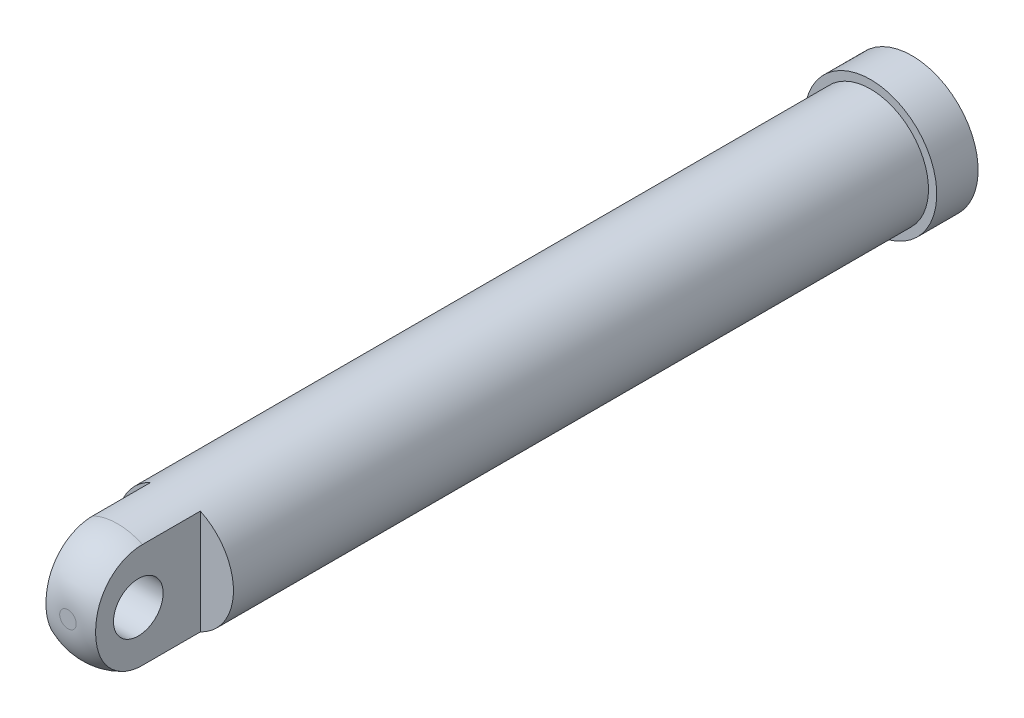
ISO-10303-21;
HEADER;
FILE_DESCRIPTION(('STEP AP214'),'2;1');
FILE_NAME('part.step','',(''),(''),'','','');
FILE_SCHEMA(('AUTOMOTIVE_DESIGN { 1 0 10303 214 1 1 1 1 }'));
ENDSEC;
DATA;
#1=APPLICATION_CONTEXT('core data for automotive mechanical design processes');
#2=APPLICATION_PROTOCOL_DEFINITION('international standard','automotive_design',2000,#1);
#3=PRODUCT_CONTEXT('',#1,'mechanical');
#4=PRODUCT('Part','Part','',(#3));
#5=PRODUCT_RELATED_PRODUCT_CATEGORY('part','',(#4));
#6=PRODUCT_DEFINITION_FORMATION('','',#4);
#7=PRODUCT_DEFINITION_CONTEXT('part definition',#1,'design');
#8=PRODUCT_DEFINITION('design','',#6,#7);
#9=PRODUCT_DEFINITION_SHAPE('','',#8);
#10=(LENGTH_UNIT() NAMED_UNIT(*) SI_UNIT(.MILLI.,.METRE.));
#11=(NAMED_UNIT(*) PLANE_ANGLE_UNIT() SI_UNIT($,.RADIAN.));
#12=(NAMED_UNIT(*) SI_UNIT($,.STERADIAN.) SOLID_ANGLE_UNIT());
#13=UNCERTAINTY_MEASURE_WITH_UNIT(LENGTH_MEASURE(1.E-05),#10,'distance_accuracy_value','');
#14=(GEOMETRIC_REPRESENTATION_CONTEXT(3) GLOBAL_UNCERTAINTY_ASSIGNED_CONTEXT((#13)) GLOBAL_UNIT_ASSIGNED_CONTEXT((#10,
#11,#12)) REPRESENTATION_CONTEXT('',''));
#15=CARTESIAN_POINT('',(0.,0.,0.));
#16=DIRECTION('',(0.,0.,1.));
#17=DIRECTION('',(1.,0.,0.));
#18=AXIS2_PLACEMENT_3D('',#15,#16,#17);
#19=CARTESIAN_POINT('',(0.,0.,396.75));
#20=DIRECTION('',(0.,0.,-1.));
#21=DIRECTION('',(-1.,0.,0.));
#22=AXIS2_PLACEMENT_3D('',#19,#20,#21);
#23=CYLINDRICAL_SURFACE('',#22,24.15);
#24=DIRECTION('',(0.,0.,1.));
#25=VECTOR('',#24,1.);
#26=CARTESIAN_POINT('',(10.35,-21.8197158551618,351.9));
#27=LINE('',#26,#25);
#28=CARTESIAN_POINT('',(10.35,-21.8197158551618,351.9));
#29=VERTEX_POINT('',#28);
#30=CARTESIAN_POINT('',(10.35,-21.8197158551618,376.05));
#31=VERTEX_POINT('',#30);
#32=EDGE_CURVE('E107',#29,#31,#27,.T.);
#33=ORIENTED_EDGE('',*,*,#32,.T.);
#34=CARTESIAN_POINT('',(0.,0.,376.05));
#35=DIRECTION('',(0.,0.,1.));
#36=DIRECTION('',(1.,0.,0.));
#37=AXIS2_PLACEMENT_3D('',#34,#35,#36);
#38=CIRCLE('',#37,24.15);
#39=CARTESIAN_POINT('',(-10.35,-21.8197158551618,376.05));
#40=VERTEX_POINT('',#39);
#41=EDGE_CURVE('E117',#31,#40,#38,.F.);
#42=ORIENTED_EDGE('',*,*,#41,.T.);
#43=DIRECTION('',(0.,0.,1.));
#44=VECTOR('',#43,1.);
#45=CARTESIAN_POINT('',(-10.35,-21.8197158551618,351.9));
#46=LINE('',#45,#44);
#47=CARTESIAN_POINT('',(-10.35,-21.8197158551618,351.9));
#48=VERTEX_POINT('',#47);
#49=EDGE_CURVE('E87',#48,#40,#46,.T.);
#50=ORIENTED_EDGE('',*,*,#49,.F.);
#51=CARTESIAN_POINT('',(0.,0.,351.9));
#52=DIRECTION('',(0.,0.,1.));
#53=DIRECTION('',(1.,0.,0.));
#54=AXIS2_PLACEMENT_3D('',#51,#52,#53);
#55=CIRCLE('',#54,24.15);
#56=CARTESIAN_POINT('',(-10.35,21.8197158551618,351.9));
#57=VERTEX_POINT('',#56);
#58=EDGE_CURVE('E88',#57,#48,#55,.T.);
#59=ORIENTED_EDGE('',*,*,#58,.F.);
#60=DIRECTION('',(0.,0.,1.));
#61=VECTOR('',#60,1.);
#62=CARTESIAN_POINT('',(-10.35,21.8197158551618,351.9));
#63=LINE('',#62,#61);
#64=CARTESIAN_POINT('',(-10.35,21.8197158551618,376.05));
#65=VERTEX_POINT('',#64);
#66=EDGE_CURVE('E79',#57,#65,#63,.T.);
#67=ORIENTED_EDGE('',*,*,#66,.T.);
#68=CARTESIAN_POINT('',(0.,0.,376.05));
#69=DIRECTION('',(0.,0.,1.));
#70=DIRECTION('',(1.,0.,0.));
#71=AXIS2_PLACEMENT_3D('',#68,#69,#70);
#72=CIRCLE('',#71,24.15);
#73=CARTESIAN_POINT('',(10.35,21.8197158551618,376.05));
#74=VERTEX_POINT('',#73);
#75=EDGE_CURVE('E115',#65,#74,#72,.F.);
#76=ORIENTED_EDGE('',*,*,#75,.T.);
#77=DIRECTION('',(0.,0.,1.));
#78=VECTOR('',#77,1.);
#79=CARTESIAN_POINT('',(10.35,21.8197158551618,351.9));
#80=LINE('',#79,#78);
#81=CARTESIAN_POINT('',(10.35,21.8197158551618,351.9));
#82=VERTEX_POINT('',#81);
#83=EDGE_CURVE('E106',#82,#74,#80,.T.);
#84=ORIENTED_EDGE('',*,*,#83,.F.);
#85=CARTESIAN_POINT('',(0.,0.,351.9));
#86=DIRECTION('',(0.,0.,1.));
#87=DIRECTION('',(1.,0.,0.));
#88=AXIS2_PLACEMENT_3D('',#85,#86,#87);
#89=CIRCLE('',#88,24.15);
#90=EDGE_CURVE('E100',#29,#82,#89,.T.);
#91=ORIENTED_EDGE('',*,*,#90,.F.);
#92=EDGE_LOOP('',(#33,#42,#50,#59,#67,#76,#84,#91));
#93=FACE_BOUND('',#92,.T.);
#94=CARTESIAN_POINT('',(0.,0.,62.1));
#95=DIRECTION('',(0.,0.,-1.));
#96=DIRECTION('',(-1.,0.,0.));
#97=AXIS2_PLACEMENT_3D('',#94,#95,#96);
#98=CIRCLE('',#97,24.15);
#99=CARTESIAN_POINT('',(-24.15,0.,62.1));
#100=VERTEX_POINT('',#99);
#101=EDGE_CURVE('E11',#100,#100,#98,.T.);
#102=ORIENTED_EDGE('',*,*,#101,.F.);
#103=EDGE_LOOP('',(#102));
#104=FACE_BOUND('',#103,.T.);
#105=ADVANCED_FACE('F35',(#93,#104),#23,.T.);
#106=CARTESIAN_POINT('',(0.,0.,396.75));
#107=DIRECTION('',(0.,0.,1.));
#108=DIRECTION('',(1.,0.,0.));
#109=AXIS2_PLACEMENT_3D('',#106,#107,#108);
#110=PLANE('',#109);
#111=CARTESIAN_POINT('',(0.,0.,396.75));
#112=DIRECTION('',(0.,0.,1.));
#113=DIRECTION('',(1.,0.,0.));
#114=AXIS2_PLACEMENT_3D('',#111,#112,#113);
#115=CIRCLE('',#114,3.45000000000001);
#116=CARTESIAN_POINT('',(1.47857142857143,3.11710226502312,396.75));
#117=VERTEX_POINT('',#116);
#118=EDGE_CURVE('E49',#117,#117,#115,.T.);
#119=ORIENTED_EDGE('',*,*,#118,.T.);
#120=EDGE_LOOP('',(#119));
#121=FACE_BOUND('',#120,.T.);
#122=ADVANCED_FACE('F141',(#121),#110,.T.);
#123=CARTESIAN_POINT('',(10.35,0.,351.9));
#124=DIRECTION('',(-1.,0.,0.));
#125=DIRECTION('',(0.,-1.,0.));
#126=AXIS2_PLACEMENT_3D('',#123,#124,#125);
#127=PLANE('',#126);
#128=CARTESIAN_POINT('',(10.35,0.,377.775));
#129=DIRECTION('',(1.,0.,0.));
#130=DIRECTION('',(0.,0.,-1.));
#131=AXIS2_PLACEMENT_3D('',#128,#129,#130);
#132=CIRCLE('',#131,10.35);
#133=CARTESIAN_POINT('',(10.35,0.,367.425));
#134=VERTEX_POINT('',#133);
#135=EDGE_CURVE('E113',#134,#134,#132,.T.);
#136=ORIENTED_EDGE('',*,*,#135,.F.);
#137=EDGE_LOOP('',(#136));
#138=FACE_BOUND('',#137,.T.);
#139=ORIENTED_EDGE('',*,*,#83,.T.);
#140=CARTESIAN_POINT('',(10.35,21.8197158551618,376.05));
#141=CARTESIAN_POINT('',(10.35,21.8197163898058,376.314426720202));
#142=CARTESIAN_POINT('',(10.35,21.8141072582747,376.578823668274));
#143=CARTESIAN_POINT('',(10.35,21.7916878615412,377.107135632862));
#144=CARTESIAN_POINT('',(10.35,21.774877875815,377.371050661237));
#145=CARTESIAN_POINT('',(10.35,21.7076864753367,378.161306675301));
#146=CARTESIAN_POINT('',(10.35,21.6405435948251,378.686312068646));
#147=CARTESIAN_POINT('',(10.35,21.4621792681263,379.728037604999));
#148=CARTESIAN_POINT('',(10.35,21.3510183465244,380.244768115108));
#149=CARTESIAN_POINT('',(10.35,21.1519259295457,381.011301720175));
#150=CARTESIAN_POINT('',(10.35,21.0801660283793,381.265397039785));
#151=CARTESIAN_POINT('',(10.35,20.9259768285565,381.770399541436));
#152=CARTESIAN_POINT('',(10.35,20.8435448493958,382.02130590506));
#153=CARTESIAN_POINT('',(10.35,20.5804626083983,382.768553413826));
#154=CARTESIAN_POINT('',(10.35,20.3840245027687,383.259428902161));
#155=CARTESIAN_POINT('',(10.35,19.9506061989533,384.2229421687));
#156=CARTESIAN_POINT('',(10.35,19.7136255813996,384.695579758191));
#157=CARTESIAN_POINT('',(10.35,19.3291767374711,385.388363382799));
#158=CARTESIAN_POINT('',(10.35,19.1961707452856,385.616635689311));
#159=CARTESIAN_POINT('',(10.35,18.9207804004236,386.067369224545));
#160=CARTESIAN_POINT('',(10.35,18.7783984674602,386.289831932052));
#161=CARTESIAN_POINT('',(10.35,18.3375069899879,386.948067682192));
#162=CARTESIAN_POINT('',(10.35,18.0252289538684,387.374729429344));
#163=CARTESIAN_POINT('',(10.35,17.3642140739705,388.203578811306));
#164=CARTESIAN_POINT('',(10.35,17.0152389596325,388.605575774716));
#165=CARTESIAN_POINT('',(10.35,16.2852865760025,389.379388931453));
#166=CARTESIAN_POINT('',(10.35,15.9043092989692,389.75120511748));
#167=CARTESIAN_POINT('',(10.35,15.1133586004994,390.462385540926));
#168=CARTESIAN_POINT('',(10.35,14.7033916202454,390.80175694804));
#169=CARTESIAN_POINT('',(10.35,13.8574706400294,391.446378775191));
#170=CARTESIAN_POINT('',(10.35,13.4215161745234,391.751628583688));
#171=CARTESIAN_POINT('',(10.35,12.5130737905583,392.335538227294));
#172=CARTESIAN_POINT('',(10.35,12.0398744696788,392.613090755877));
#173=CARTESIAN_POINT('',(10.35,11.0729317660166,393.129658640617));
#174=CARTESIAN_POINT('',(10.35,10.579188378746,393.368673988355));
#175=CARTESIAN_POINT('',(10.35,9.57457122598523,393.808036218003));
#176=CARTESIAN_POINT('',(10.35,9.06369028877769,394.008366668025));
#177=CARTESIAN_POINT('',(10.35,8.02854510435635,394.370710959167));
#178=CARTESIAN_POINT('',(10.35,7.5042797300904,394.532721561651));
#179=CARTESIAN_POINT('',(10.35,6.25217150693814,394.871976583993));
#180=CARTESIAN_POINT('',(10.35,5.51995283923633,395.033148795995));
#181=CARTESIAN_POINT('',(10.35,4.04404700894939,395.290747522017));
#182=CARTESIAN_POINT('',(10.35,3.30035479995983,395.38714466455));
#183=CARTESIAN_POINT('',(10.35,2.17987579464592,395.486895250026));
#184=CARTESIAN_POINT('',(10.35,1.80492570641525,395.512676640977));
#185=CARTESIAN_POINT('',(10.35,1.05431576471458,395.549573677225));
#186=CARTESIAN_POINT('',(10.35,0.678655976563356,395.560690612073));
#187=CARTESIAN_POINT('',(10.35,-0.0727343236145097,395.568467886445));
#188=CARTESIAN_POINT('',(10.35,-0.44846480847418,395.565130983685));
#189=CARTESIAN_POINT('',(10.35,-1.199652059975,395.543941168084));
#190=CARTESIAN_POINT('',(10.35,-1.57510867991491,395.526083044107));
#191=CARTESIAN_POINT('',(10.35,-2.33227028224054,395.475036270462));
#192=CARTESIAN_POINT('',(10.35,-2.71395617934209,395.441558704995));
#193=CARTESIAN_POINT('',(10.35,-3.47557954987655,395.358653398626));
#194=CARTESIAN_POINT('',(10.35,-3.85551689464285,395.3092245024));
#195=CARTESIAN_POINT('',(10.35,-4.99158961351029,395.135970377301));
#196=CARTESIAN_POINT('',(10.35,-5.74421309374333,394.987163221526));
#197=CARTESIAN_POINT('',(10.35,-6.85802359841206,394.710674257788));
#198=CARTESIAN_POINT('',(10.35,-7.22608244839668,394.609875247041));
#199=CARTESIAN_POINT('',(10.35,-7.95670956229317,394.390050092547));
#200=CARTESIAN_POINT('',(10.35,-8.31927859494068,394.271026527202));
#201=CARTESIAN_POINT('',(10.35,-9.03770420857311,394.014440235444));
#202=CARTESIAN_POINT('',(10.35,-9.3935623976585,393.876882016479));
#203=CARTESIAN_POINT('',(10.35,-10.0974416866775,393.583052035536));
#204=CARTESIAN_POINT('',(10.35,-10.44546307163,393.426780955442));
#205=CARTESIAN_POINT('',(10.35,-11.2923077628391,393.018415829256));
#206=CARTESIAN_POINT('',(10.35,-11.7859964327409,392.755555710352));
#207=CARTESIAN_POINT('',(10.35,-12.7500207429692,392.190213058397));
#208=CARTESIAN_POINT('',(10.35,-13.2203601904227,391.88773701424));
#209=CARTESIAN_POINT('',(10.35,-14.1343904267923,391.244092146487));
#210=CARTESIAN_POINT('',(10.35,-14.5780593056893,390.902892157872));
#211=CARTESIAN_POINT('',(10.35,-15.434665448902,390.183822042701));
#212=CARTESIAN_POINT('',(10.35,-15.8476014732961,389.805950438039));
#213=CARTESIAN_POINT('',(10.35,-16.6400535502352,389.015102354244));
#214=CARTESIAN_POINT('',(10.35,-17.0195007171076,388.602056799569));
#215=CARTESIAN_POINT('',(10.35,-17.7408061982901,387.744338357899));
#216=CARTESIAN_POINT('',(10.35,-18.0826643814009,387.299665360522));
#217=CARTESIAN_POINT('',(10.35,-18.7257344997865,386.382080182752));
#218=CARTESIAN_POINT('',(10.35,-19.0269619751321,385.909178899262));
#219=CARTESIAN_POINT('',(10.35,-19.5863140684447,384.938566373604));
#220=CARTESIAN_POINT('',(10.35,-19.8444402256896,384.440856018266));
#221=CARTESIAN_POINT('',(10.35,-20.3054718261749,383.445786718284));
#222=CARTESIAN_POINT('',(10.35,-20.5102449247515,382.949295583655));
#223=CARTESIAN_POINT('',(10.35,-20.7849492492941,382.192957673066));
#224=CARTESIAN_POINT('',(10.35,-20.8711106058127,381.938902327321));
#225=CARTESIAN_POINT('',(10.35,-21.0324955751728,381.427264504519));
#226=CARTESIAN_POINT('',(10.35,-21.1077162244807,381.169681092402));
#227=CARTESIAN_POINT('',(10.35,-21.3166784189799,380.392479258435));
#228=CARTESIAN_POINT('',(10.35,-21.4337647910346,379.868286484958));
#229=CARTESIAN_POINT('',(10.35,-21.6224809524453,378.811783706652));
#230=CARTESIAN_POINT('',(10.35,-21.6941112596733,378.279473794371));
#231=CARTESIAN_POINT('',(10.35,-21.7666415632442,377.482522401876));
#232=CARTESIAN_POINT('',(10.35,-21.7849866209967,377.219372099423));
#233=CARTESIAN_POINT('',(10.35,-21.8105324974311,376.692600108099));
#234=CARTESIAN_POINT('',(10.35,-21.8177362539687,376.428978561855));
#235=CARTESIAN_POINT('',(10.35,-21.8226086488527,375.637971682625));
#236=CARTESIAN_POINT('',(10.35,-21.8035428946739,375.110394790701));
#237=CARTESIAN_POINT('',(10.35,-21.72086029895,374.058316730138));
#238=CARTESIAN_POINT('',(10.35,-21.6572076176794,373.533818378323));
#239=CARTESIAN_POINT('',(10.35,-21.5286995538489,372.752613373251));
#240=CARTESIAN_POINT('',(10.35,-21.4803500285391,372.493101171352));
#241=CARTESIAN_POINT('',(10.35,-21.3727308226419,371.976342867929));
#242=CARTESIAN_POINT('',(10.35,-21.3134608161966,371.719096834266));
#243=CARTESIAN_POINT('',(10.35,-21.2487778126976,371.463188848341));
#244=B_SPLINE_CURVE_WITH_KNOTS('',3,(#140,#141,#142,#143,#144,#145,#146,#147,#148,#149,#150,
#151,#152,#153,#154,#155,#156,#157,#158,#159,#160,#161,#162,#163,#164,#165,#166,#167,#168,#169,
#170,#171,#172,#173,#174,#175,#176,#177,#178,#179,#180,#181,#182,#183,#184,#185,#186,#187,#188,
#189,#190,#191,#192,#193,#194,#195,#196,#197,#198,#199,#200,#201,#202,#203,#204,#205,#206,#207,
#208,#209,#210,#211,#212,#213,#214,#215,#216,#217,#218,#219,#220,#221,#222,#223,#224,#225,#226,
#227,#228,#229,#230,#231,#232,#233,#234,#235,#236,#237,#238,#239,#240,#241,#242,#243),
.UNSPECIFIED.,.F.,.F.,(4,2,2,2,2,2,2,2,2,2,2,2,2,2,2,2,2,2,2,2,2,2,2,2,2,2,2,2,2,2,2,2,2,2,2,2,
2,2,2,2,2,2,2,2,2,2,2,2,2,2,2,4),(0.,0.793161277684144,1.58630276567981,3.17212681726539,
4.75577789831348,5.54767409766578,6.33976958476033,7.92394225195834,9.5081313066826,
10.3005130089286,11.0926910112352,12.6769064992564,14.2721305909451,15.8673550685231,
17.4622262123594,19.0571259355623,20.7011051060827,22.345084635741,23.9897609373033,
25.6345761905466,27.8805256920781,30.1274929068285,31.2547678384195,32.3819436340067,
33.5089043797467,34.6362697290339,35.7853692544243,36.9345520256002,39.2322359978884,
40.3767025387888,41.5210073103958,42.6650342988446,43.8090196124376,45.4850018111027,
47.1607098346205,48.8377761607517,50.5149101117427,52.1954171685542,53.8759300907694,
55.5557984317214,57.2356067666773,58.8446766758452,59.6492684438145,60.4540777490612,
62.0633058817002,63.6725156803934,64.4636775278628,65.2546307178446,66.8363890182999,
68.4194202240135,69.2111473239715,70.0028980522257),.UNSPECIFIED.);
#245=EDGE_CURVE('E44',#74,#31,#244,.T.);
#246=ORIENTED_EDGE('',*,*,#245,.T.);
#247=ORIENTED_EDGE('',*,*,#32,.F.);
#248=DIRECTION('',(0.,-1.,0.));
#249=VECTOR('',#248,1.);
#250=CARTESIAN_POINT('',(10.35,0.,351.9));
#251=LINE('',#250,#249);
#252=EDGE_CURVE('E103',#82,#29,#251,.T.);
#253=ORIENTED_EDGE('',*,*,#252,.F.);
#254=EDGE_LOOP('',(#139,#246,#247,#253));
#255=FACE_BOUND('',#254,.T.);
#256=ADVANCED_FACE('F136',(#138,#255),#127,.F.);
#257=CARTESIAN_POINT('',(0.,0.,351.9));
#258=DIRECTION('',(0.,0.,1.));
#259=DIRECTION('',(1.,0.,0.));
#260=AXIS2_PLACEMENT_3D('',#257,#258,#259);
#261=PLANE('',#260);
#262=ORIENTED_EDGE('',*,*,#90,.T.);
#263=ORIENTED_EDGE('',*,*,#252,.T.);
#264=EDGE_LOOP('',(#262,#263));
#265=FACE_BOUND('',#264,.T.);
#266=ADVANCED_FACE('F132',(#265),#261,.T.);
#267=CARTESIAN_POINT('',(-10.35,0.,351.9));
#268=DIRECTION('',(-1.,0.,0.));
#269=DIRECTION('',(0.,-1.,0.));
#270=AXIS2_PLACEMENT_3D('',#267,#268,#269);
#271=PLANE('',#270);
#272=CARTESIAN_POINT('',(-10.35,0.,377.775));
#273=DIRECTION('',(-1.,0.,0.));
#274=DIRECTION('',(0.,-1.,0.));
#275=AXIS2_PLACEMENT_3D('',#272,#273,#274);
#276=CIRCLE('',#275,10.35);
#277=CARTESIAN_POINT('',(-10.35,-10.35,377.775));
#278=VERTEX_POINT('',#277);
#279=EDGE_CURVE('E93',#278,#278,#276,.T.);
#280=ORIENTED_EDGE('',*,*,#279,.F.);
#281=EDGE_LOOP('',(#280));
#282=FACE_BOUND('',#281,.T.);
#283=ORIENTED_EDGE('',*,*,#49,.T.);
#284=CARTESIAN_POINT('',(-10.35,-21.8197158551618,376.05));
#285=CARTESIAN_POINT('',(-10.35,-21.8197163898058,376.314426720202));
#286=CARTESIAN_POINT('',(-10.35,-21.8141072582747,376.578823668274));
#287=CARTESIAN_POINT('',(-10.35,-21.7916878615412,377.107135632862));
#288=CARTESIAN_POINT('',(-10.35,-21.774877875815,377.371050661237));
#289=CARTESIAN_POINT('',(-10.35,-21.7076864753367,378.161306675301));
#290=CARTESIAN_POINT('',(-10.35,-21.6405435948251,378.686312068646));
#291=CARTESIAN_POINT('',(-10.35,-21.4621792681264,379.728037604999));
#292=CARTESIAN_POINT('',(-10.35,-21.3510183465244,380.244768115108));
#293=CARTESIAN_POINT('',(-10.35,-21.1519259295458,381.011301720175));
#294=CARTESIAN_POINT('',(-10.35,-21.0801660283794,381.265397039785));
#295=CARTESIAN_POINT('',(-10.35,-20.9259768285566,381.770399541436));
#296=CARTESIAN_POINT('',(-10.35,-20.8435448493958,382.02130590506));
#297=CARTESIAN_POINT('',(-10.35,-20.5804626083983,382.768553413826));
#298=CARTESIAN_POINT('',(-10.35,-20.3840245027687,383.259428902161));
#299=CARTESIAN_POINT('',(-10.35,-19.9506061989533,384.2229421687));
#300=CARTESIAN_POINT('',(-10.35,-19.7136255813995,384.695579758191));
#301=CARTESIAN_POINT('',(-10.35,-19.329176737471,385.388363382799));
#302=CARTESIAN_POINT('',(-10.35,-19.1961707452856,385.616635689311));
#303=CARTESIAN_POINT('',(-10.35,-18.9207804004236,386.067369224545));
#304=CARTESIAN_POINT('',(-10.35,-18.7783984674602,386.289831932052));
#305=CARTESIAN_POINT('',(-10.35,-18.3375069899879,386.948067682192));
#306=CARTESIAN_POINT('',(-10.35,-18.0252289538684,387.374729429344));
#307=CARTESIAN_POINT('',(-10.35,-17.3642140739705,388.203578811306));
#308=CARTESIAN_POINT('',(-10.35,-17.0152389596325,388.605575774716));
#309=CARTESIAN_POINT('',(-10.35,-16.2852865760025,389.379388931453));
#310=CARTESIAN_POINT('',(-10.35,-15.9043092989692,389.75120511748));
#311=CARTESIAN_POINT('',(-10.35,-15.1133586004994,390.462385540926));
#312=CARTESIAN_POINT('',(-10.35,-14.7033916202455,390.80175694804));
#313=CARTESIAN_POINT('',(-10.35,-13.8574706400294,391.446378775191));
#314=CARTESIAN_POINT('',(-10.35,-13.4215161745234,391.751628583688));
#315=CARTESIAN_POINT('',(-10.35,-12.5130737905583,392.335538227294));
#316=CARTESIAN_POINT('',(-10.35,-12.0398744696788,392.613090755877));
#317=CARTESIAN_POINT('',(-10.35,-11.0729317660166,393.129658640617));
#318=CARTESIAN_POINT('',(-10.35,-10.579188378746,393.368673988355));
#319=CARTESIAN_POINT('',(-10.35,-9.57457122598529,393.808036218003));
#320=CARTESIAN_POINT('',(-10.35,-9.06369028877777,394.008366668025));
#321=CARTESIAN_POINT('',(-10.35,-8.02854510435645,394.370710959167));
#322=CARTESIAN_POINT('',(-10.35,-7.50427973009051,394.532721561651));
#323=CARTESIAN_POINT('',(-10.35,-6.25217150693826,394.871976583993));
#324=CARTESIAN_POINT('',(-10.35,-5.51995283923645,395.033148795995));
#325=CARTESIAN_POINT('',(-10.35,-4.0440470089495,395.290747522017));
#326=CARTESIAN_POINT('',(-10.35,-3.30035479995994,395.38714466455));
#327=CARTESIAN_POINT('',(-10.35,-2.17987579464603,395.486895250026));
#328=CARTESIAN_POINT('',(-10.35,-1.80492570641536,395.512676640977));
#329=CARTESIAN_POINT('',(-10.35,-1.05431576471469,395.549573677225));
#330=CARTESIAN_POINT('',(-10.35,-0.678655976563462,395.560690612073));
#331=CARTESIAN_POINT('',(-10.35,0.072734323614404,395.568467886445));
#332=CARTESIAN_POINT('',(-10.35,0.448464808474075,395.565130983685));
#333=CARTESIAN_POINT('',(-10.35,1.1996520599749,395.543941168084));
#334=CARTESIAN_POINT('',(-10.35,1.5751086799148,395.526083044107));
#335=CARTESIAN_POINT('',(-10.35,2.33227028224044,395.475036270462));
#336=CARTESIAN_POINT('',(-10.35,2.71395617934199,395.441558704995));
#337=CARTESIAN_POINT('',(-10.35,3.47557954987645,395.358653398627));
#338=CARTESIAN_POINT('',(-10.35,3.85551689464275,395.3092245024));
#339=CARTESIAN_POINT('',(-10.35,4.99158961351018,395.135970377302));
#340=CARTESIAN_POINT('',(-10.35,5.7442130937432,394.987163221526));
#341=CARTESIAN_POINT('',(-10.35,6.85802359841193,394.710674257788));
#342=CARTESIAN_POINT('',(-10.35,7.22608244839656,394.609875247041));
#343=CARTESIAN_POINT('',(-10.35,7.95670956229305,394.390050092547));
#344=CARTESIAN_POINT('',(-10.35,8.31927859494055,394.271026527202));
#345=CARTESIAN_POINT('',(-10.35,9.03770420857298,394.014440235444));
#346=CARTESIAN_POINT('',(-10.35,9.39356239765837,393.876882016479));
#347=CARTESIAN_POINT('',(-10.35,10.0974416866774,393.583052035536));
#348=CARTESIAN_POINT('',(-10.35,10.4454630716299,393.426780955442));
#349=CARTESIAN_POINT('',(-10.35,11.292307762839,393.018415829257));
#350=CARTESIAN_POINT('',(-10.35,11.7859964327408,392.755555710352));
#351=CARTESIAN_POINT('',(-10.35,12.7500207429691,392.190213058397));
#352=CARTESIAN_POINT('',(-10.35,13.2203601904225,391.88773701424));
#353=CARTESIAN_POINT('',(-10.35,14.1343904267922,391.244092146487));
#354=CARTESIAN_POINT('',(-10.35,14.5780593056891,390.902892157872));
#355=CARTESIAN_POINT('',(-10.35,15.4346654489019,390.183822042701));
#356=CARTESIAN_POINT('',(-10.35,15.847601473296,389.805950438039));
#357=CARTESIAN_POINT('',(-10.35,16.6400535502351,389.015102354245));
#358=CARTESIAN_POINT('',(-10.35,17.0195007171074,388.602056799569));
#359=CARTESIAN_POINT('',(-10.35,17.74080619829,387.744338357899));
#360=CARTESIAN_POINT('',(-10.35,18.0826643814008,387.299665360522));
#361=CARTESIAN_POINT('',(-10.35,18.7257344997864,386.382080182752));
#362=CARTESIAN_POINT('',(-10.35,19.026961975132,385.909178899262));
#363=CARTESIAN_POINT('',(-10.35,19.5863140684446,384.938566373604));
#364=CARTESIAN_POINT('',(-10.35,19.8444402256895,384.440856018267));
#365=CARTESIAN_POINT('',(-10.35,20.3054718261748,383.445786718285));
#366=CARTESIAN_POINT('',(-10.35,20.5102449247514,382.949295583655));
#367=CARTESIAN_POINT('',(-10.35,20.784949249294,382.192957673066));
#368=CARTESIAN_POINT('',(-10.35,20.8711106058127,381.938902327322));
#369=CARTESIAN_POINT('',(-10.35,21.0324955751727,381.427264504519));
#370=CARTESIAN_POINT('',(-10.35,21.1077162244807,381.169681092403));
#371=CARTESIAN_POINT('',(-10.35,21.3166784189798,380.392479258435));
#372=CARTESIAN_POINT('',(-10.35,21.4337647910345,379.868286484958));
#373=CARTESIAN_POINT('',(-10.35,21.6224809524453,378.811783706652));
#374=CARTESIAN_POINT('',(-10.35,21.6941112596733,378.279473794371));
#375=CARTESIAN_POINT('',(-10.35,21.7666415632442,377.482522401877));
#376=CARTESIAN_POINT('',(-10.35,21.7849866209967,377.219372099423));
#377=CARTESIAN_POINT('',(-10.35,21.8105324974311,376.6926001081));
#378=CARTESIAN_POINT('',(-10.35,21.8177362539687,376.428978561856));
#379=CARTESIAN_POINT('',(-10.35,21.8226086488527,375.637971682625));
#380=CARTESIAN_POINT('',(-10.35,21.8035428946739,375.110394790701));
#381=CARTESIAN_POINT('',(-10.35,21.72086029895,374.058316730138));
#382=CARTESIAN_POINT('',(-10.35,21.6572076176794,373.533818378323));
#383=CARTESIAN_POINT('',(-10.35,21.5286995538489,372.752613373251));
#384=CARTESIAN_POINT('',(-10.35,21.4803500285391,372.493101171352));
#385=CARTESIAN_POINT('',(-10.35,21.3727308226419,371.976342867929));
#386=CARTESIAN_POINT('',(-10.35,21.3134608161966,371.719096834266));
#387=CARTESIAN_POINT('',(-10.35,21.2487778126976,371.463188848341));
#388=B_SPLINE_CURVE_WITH_KNOTS('',3,(#284,#285,#286,#287,#288,#289,#290,#291,#292,#293,#294,
#295,#296,#297,#298,#299,#300,#301,#302,#303,#304,#305,#306,#307,#308,#309,#310,#311,#312,#313,
#314,#315,#316,#317,#318,#319,#320,#321,#322,#323,#324,#325,#326,#327,#328,#329,#330,#331,#332,
#333,#334,#335,#336,#337,#338,#339,#340,#341,#342,#343,#344,#345,#346,#347,#348,#349,#350,#351,
#352,#353,#354,#355,#356,#357,#358,#359,#360,#361,#362,#363,#364,#365,#366,#367,#368,#369,#370,
#371,#372,#373,#374,#375,#376,#377,#378,#379,#380,#381,#382,#383,#384,#385,#386,#387),
.UNSPECIFIED.,.F.,.F.,(4,2,2,2,2,2,2,2,2,2,2,2,2,2,2,2,2,2,2,2,2,2,2,2,2,2,2,2,2,2,2,2,2,2,2,2,
2,2,2,2,2,2,2,2,2,2,2,2,2,2,2,4),(0.,0.793161277684144,1.58630276567975,3.17212681726533,
4.75577789831342,5.54767409766572,6.33976958476027,7.92394225195839,9.50813130668272,
10.3005130089287,11.0926910112353,12.6769064992564,14.2721305909452,15.8673550685231,
17.4622262123594,19.0571259355624,20.7011051060827,22.345084635741,23.9897609373033,
25.6345761905465,27.880525692078,30.1274929068284,31.2547678384194,32.3819436340066,
33.5089043797467,34.6362697290339,35.7853692544242,36.9345520256001,39.2322359978883,
40.3767025387887,41.5210073103957,42.6650342988445,43.8090196124375,45.4850018111026,
47.1607098346204,48.8377761607516,50.5149101117426,52.195417168554,53.8759300907692,
55.5557984317211,57.235606766677,58.844676675845,59.6492684438144,60.4540777490611,
62.0633058817,63.6725156803933,64.4636775278627,65.2546307178444,66.8363890182998,
68.4194202240134,69.2111473239715,70.0028980522256),.UNSPECIFIED.);
#389=EDGE_CURVE('E56',#40,#65,#388,.T.);
#390=ORIENTED_EDGE('',*,*,#389,.T.);
#391=ORIENTED_EDGE('',*,*,#66,.F.);
#392=DIRECTION('',(0.,-1.,0.));
#393=VECTOR('',#392,1.);
#394=CARTESIAN_POINT('',(-10.35,0.,351.9));
#395=LINE('',#394,#393);
#396=EDGE_CURVE('E83',#57,#48,#395,.T.);
#397=ORIENTED_EDGE('',*,*,#396,.T.);
#398=EDGE_LOOP('',(#283,#390,#391,#397));
#399=FACE_BOUND('',#398,.T.);
#400=ADVANCED_FACE('F82',(#282,#399),#271,.T.);
#401=CARTESIAN_POINT('',(0.,0.,351.9));
#402=DIRECTION('',(0.,0.,1.));
#403=DIRECTION('',(1.,0.,0.));
#404=AXIS2_PLACEMENT_3D('',#401,#402,#403);
#405=PLANE('',#404);
#406=ORIENTED_EDGE('',*,*,#396,.F.);
#407=ORIENTED_EDGE('',*,*,#58,.T.);
#408=EDGE_LOOP('',(#406,#407));
#409=FACE_BOUND('',#408,.T.);
#410=ADVANCED_FACE('F91',(#409),#405,.T.);
#411=CARTESIAN_POINT('',(-34.5,0.,377.775));
#412=DIRECTION('',(1.,0.,0.));
#413=DIRECTION('',(0.,0.,-1.));
#414=AXIS2_PLACEMENT_3D('',#411,#412,#413);
#415=CYLINDRICAL_SURFACE('',#414,10.35);
#416=ORIENTED_EDGE('',*,*,#279,.T.);
#417=EDGE_LOOP('',(#416));
#418=FACE_BOUND('',#417,.T.);
#419=ORIENTED_EDGE('',*,*,#135,.T.);
#420=EDGE_LOOP('',(#419));
#421=FACE_BOUND('',#420,.T.);
#422=ADVANCED_FACE('F170',(#418,#421),#415,.F.);
#423=CARTESIAN_POINT('',(0.,0.,376.05));
#424=DIRECTION('',(0.,0.,1.));
#425=DIRECTION('',(1.,0.,0.));
#426=AXIS2_PLACEMENT_3D('',#423,#424,#425);
#427=DEGENERATE_TOROIDAL_SURFACE('',#426,3.45000000000001,20.7,.T.);
#428=ORIENTED_EDGE('',*,*,#389,.F.);
#429=ORIENTED_EDGE('',*,*,#41,.F.);
#430=ORIENTED_EDGE('',*,*,#245,.F.);
#431=ORIENTED_EDGE('',*,*,#75,.F.);
#432=EDGE_LOOP('',(#428,#429,#430,#431));
#433=FACE_BOUND('',#432,.T.);
#434=ORIENTED_EDGE('',*,*,#118,.F.);
#435=EDGE_LOOP('',(#434));
#436=FACE_BOUND('',#435,.T.);
#437=ADVANCED_FACE('F37',(#433,#436),#427,.T.);
#438=CARTESIAN_POINT('',(0.,0.,62.1));
#439=DIRECTION('',(0.,0.,-1.));
#440=DIRECTION('',(-1.,0.,0.));
#441=AXIS2_PLACEMENT_3D('',#438,#439,#440);
#442=CYLINDRICAL_SURFACE('',#441,27.6);
#443=CARTESIAN_POINT('',(0.,0.,62.1));
#444=DIRECTION('',(0.,0.,-1.));
#445=DIRECTION('',(-1.,0.,0.));
#446=AXIS2_PLACEMENT_3D('',#443,#444,#445);
#447=CIRCLE('',#446,27.6);
#448=CARTESIAN_POINT('',(-27.6,0.,62.1));
#449=VERTEX_POINT('',#448);
#450=EDGE_CURVE('E260',#449,#449,#447,.T.);
#451=ORIENTED_EDGE('',*,*,#450,.T.);
#452=EDGE_LOOP('',(#451));
#453=FACE_BOUND('',#452,.T.);
#454=CARTESIAN_POINT('',(0.,0.,44.85));
#455=DIRECTION('',(0.,0.,-1.));
#456=DIRECTION('',(-1.,0.,0.));
#457=AXIS2_PLACEMENT_3D('',#454,#455,#456);
#458=CIRCLE('',#457,27.6);
#459=CARTESIAN_POINT('',(-27.6,0.,44.85));
#460=VERTEX_POINT('',#459);
#461=EDGE_CURVE('E258',#460,#460,#458,.T.);
#462=ORIENTED_EDGE('',*,*,#461,.F.);
#463=EDGE_LOOP('',(#462));
#464=FACE_BOUND('',#463,.T.);
#465=ADVANCED_FACE('F182',(#453,#464),#442,.T.);
#466=CARTESIAN_POINT('',(0.,0.,62.1));
#467=DIRECTION('',(0.,0.,-1.));
#468=DIRECTION('',(-1.,0.,0.));
#469=AXIS2_PLACEMENT_3D('',#466,#467,#468);
#470=PLANE('',#469);
#471=ORIENTED_EDGE('',*,*,#101,.T.);
#472=EDGE_LOOP('',(#471));
#473=FACE_BOUND('',#472,.T.);
#474=ORIENTED_EDGE('',*,*,#450,.F.);
#475=EDGE_LOOP('',(#474));
#476=FACE_BOUND('',#475,.T.);
#477=ADVANCED_FACE('F188',(#473,#476),#470,.F.);
#478=CARTESIAN_POINT('',(0.,0.,337.065));
#479=DIRECTION('',(0.,0.,-1.));
#480=DIRECTION('',(-1.,0.,0.));
#481=AXIS2_PLACEMENT_3D('',#478,#479,#480);
#482=PLANE('',#481);
#483=CARTESIAN_POINT('',(0.,0.,337.065));
#484=DIRECTION('',(0.,0.,-1.));
#485=DIRECTION('',(-1.,0.,0.));
#486=AXIS2_PLACEMENT_3D('',#483,#484,#485);
#487=CIRCLE('',#486,17.25);
#488=CARTESIAN_POINT('',(-17.25,0.,337.065));
#489=VERTEX_POINT('',#488);
#490=EDGE_CURVE('E265',#489,#489,#487,.T.);
#491=ORIENTED_EDGE('',*,*,#490,.T.);
#492=EDGE_LOOP('',(#491));
#493=FACE_BOUND('',#492,.T.);
#494=ADVANCED_FACE('F196',(#493),#482,.T.);
#495=CARTESIAN_POINT('',(0.,0.,337.065));
#496=DIRECTION('',(0.,0.,-1.));
#497=DIRECTION('',(-1.,0.,0.));
#498=AXIS2_PLACEMENT_3D('',#495,#496,#497);
#499=CYLINDRICAL_SURFACE('',#498,17.25);
#500=ORIENTED_EDGE('',*,*,#490,.F.);
#501=EDGE_LOOP('',(#500));
#502=FACE_BOUND('',#501,.T.);
#503=CARTESIAN_POINT('',(0.,0.,44.85));
#504=DIRECTION('',(0.,0.,-1.));
#505=DIRECTION('',(-1.,0.,0.));
#506=AXIS2_PLACEMENT_3D('',#503,#504,#505);
#507=CIRCLE('',#506,17.25);
#508=CARTESIAN_POINT('',(-17.25,0.,44.85));
#509=VERTEX_POINT('',#508);
#510=EDGE_CURVE('E255',#509,#509,#507,.F.);
#511=ORIENTED_EDGE('',*,*,#510,.F.);
#512=EDGE_LOOP('',(#511));
#513=FACE_BOUND('',#512,.T.);
#514=ADVANCED_FACE('F204',(#502,#513),#499,.F.);
#515=CARTESIAN_POINT('',(0.,0.,44.85));
#516=DIRECTION('',(0.,0.,-1.));
#517=DIRECTION('',(-1.,0.,0.));
#518=AXIS2_PLACEMENT_3D('',#515,#516,#517);
#519=PLANE('',#518);
#520=ORIENTED_EDGE('',*,*,#510,.T.);
#521=EDGE_LOOP('',(#520));
#522=FACE_BOUND('',#521,.T.);
#523=ORIENTED_EDGE('',*,*,#461,.T.);
#524=EDGE_LOOP('',(#523));
#525=FACE_BOUND('',#524,.T.);
#526=ADVANCED_FACE('F212',(#522,#525),#519,.T.);
#527=CLOSED_SHELL('',(#105,#122,#256,#266,#400,#410,#422,#437,#465,#477,#494,#514,#526));
#528=MANIFOLD_SOLID_BREP('B2',#527);
#529=ADVANCED_BREP_SHAPE_REPRESENTATION('',(#18,#528),#14);
#530=SHAPE_DEFINITION_REPRESENTATION(#9,#529);
ENDSEC;
END-ISO-10303-21;
